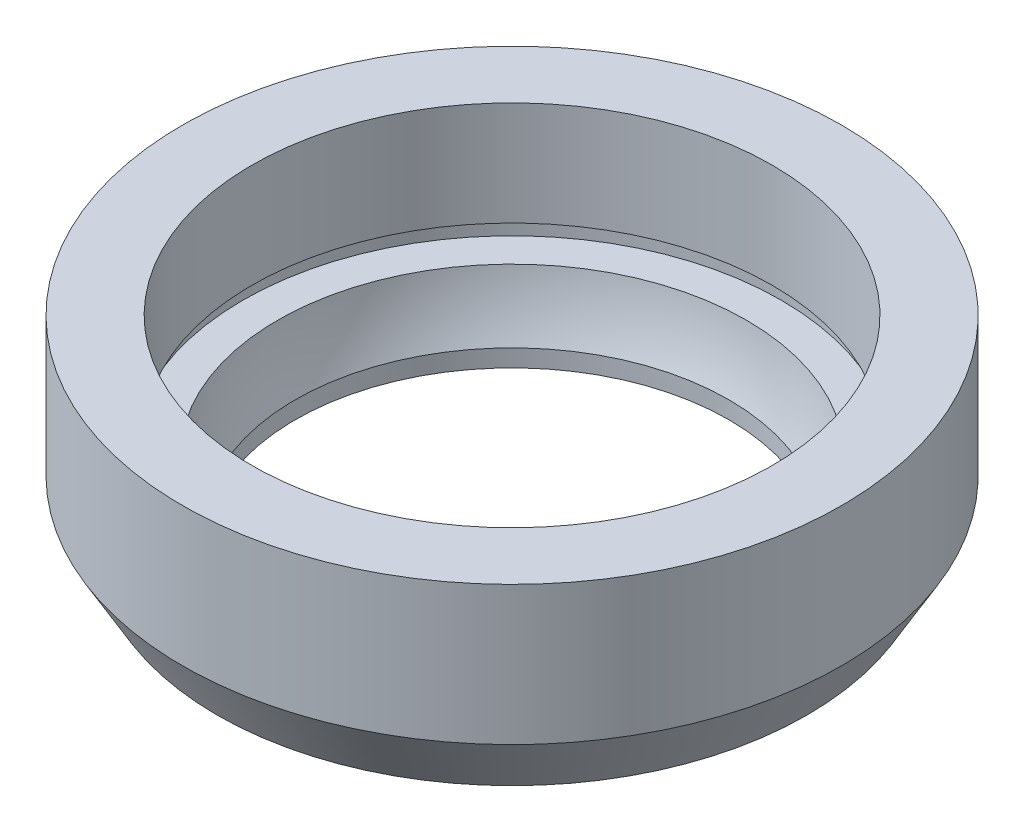
ISO-10303-21;
HEADER;
FILE_DESCRIPTION(('STEP AP214'),'2;1');
FILE_NAME('part.step','',(''),(''),'','','');
FILE_SCHEMA(('AUTOMOTIVE_DESIGN { 1 0 10303 214 1 1 1 1 }'));
ENDSEC;
DATA;
#1=APPLICATION_CONTEXT('core data for automotive mechanical design processes');
#2=APPLICATION_PROTOCOL_DEFINITION('international standard','automotive_design',2000,#1);
#3=PRODUCT_CONTEXT('',#1,'mechanical');
#4=PRODUCT('Part','Part','',(#3));
#5=PRODUCT_RELATED_PRODUCT_CATEGORY('part','',(#4));
#6=PRODUCT_DEFINITION_FORMATION('','',#4);
#7=PRODUCT_DEFINITION_CONTEXT('part definition',#1,'design');
#8=PRODUCT_DEFINITION('design','',#6,#7);
#9=PRODUCT_DEFINITION_SHAPE('','',#8);
#10=(LENGTH_UNIT() NAMED_UNIT(*) SI_UNIT(.MILLI.,.METRE.));
#11=(NAMED_UNIT(*) PLANE_ANGLE_UNIT() SI_UNIT($,.RADIAN.));
#12=(NAMED_UNIT(*) SI_UNIT($,.STERADIAN.) SOLID_ANGLE_UNIT());
#13=UNCERTAINTY_MEASURE_WITH_UNIT(LENGTH_MEASURE(1.E-05),#10,'distance_accuracy_value','');
#14=(GEOMETRIC_REPRESENTATION_CONTEXT(3) GLOBAL_UNCERTAINTY_ASSIGNED_CONTEXT((#13)) GLOBAL_UNIT_ASSIGNED_CONTEXT((#10,
#11,#12)) REPRESENTATION_CONTEXT('',''));
#15=CARTESIAN_POINT('',(0.,0.,0.));
#16=DIRECTION('',(0.,0.,1.));
#17=DIRECTION('',(1.,0.,0.));
#18=AXIS2_PLACEMENT_3D('',#15,#16,#17);
#19=CARTESIAN_POINT('',(0.,-120.969555658552,0.));
#20=DIRECTION('',(0.,-1.,0.));
#21=DIRECTION('',(0.,0.,-1.));
#22=AXIS2_PLACEMENT_3D('',#19,#20,#21);
#23=DEGENERATE_TOROIDAL_SURFACE('',#22,0.852252677091742,135.859768313158,.T.);
#24=CARTESIAN_POINT('',(0.,-141.511992468657,0.));
#25=DIRECTION('',(0.,-1.,0.));
#26=DIRECTION('',(0.,0.,-1.));
#27=AXIS2_PLACEMENT_3D('',#24,#25,#26);
#28=CIRCLE('',#27,135.15);
#29=CARTESIAN_POINT('',(0.,-141.511992468657,-135.15));
#30=VERTEX_POINT('',#29);
#31=EDGE_CURVE('E82',#30,#30,#28,.T.);
#32=ORIENTED_EDGE('',*,*,#31,.F.);
#33=EDGE_LOOP('',(#32));
#34=FACE_BOUND('',#33,.T.);
#35=CARTESIAN_POINT('',(0.,-176.153008620035,0.));
#36=DIRECTION('',(0.,-1.,0.));
#37=DIRECTION('',(0.,0.,-1.));
#38=AXIS2_PLACEMENT_3D('',#35,#36,#37);
#39=CIRCLE('',#38,125.);
#40=CARTESIAN_POINT('',(0.,-176.153008620035,-125.));
#41=VERTEX_POINT('',#40);
#42=EDGE_CURVE('E10',#41,#41,#39,.T.);
#43=ORIENTED_EDGE('',*,*,#42,.T.);
#44=EDGE_LOOP('',(#43));
#45=FACE_BOUND('',#44,.T.);
#46=ADVANCED_FACE('F39',(#34,#45),#23,.F.);
#47=CARTESIAN_POINT('',(0.,-202.934552656107,0.));
#48=DIRECTION('',(0.,-1.,0.));
#49=DIRECTION('',(0.,0.,-1.));
#50=AXIS2_PLACEMENT_3D('',#47,#48,#49);
#51=CYLINDRICAL_SURFACE('',#50,125.);
#52=ORIENTED_EDGE('',*,*,#42,.F.);
#53=EDGE_LOOP('',(#52));
#54=FACE_BOUND('',#53,.T.);
#55=CARTESIAN_POINT('',(0.,-186.153008620035,0.));
#56=DIRECTION('',(0.,-1.,0.));
#57=DIRECTION('',(0.,0.,-1.));
#58=AXIS2_PLACEMENT_3D('',#55,#56,#57);
#59=CIRCLE('',#58,125.);
#60=CARTESIAN_POINT('',(0.,-186.153008620035,-125.));
#61=VERTEX_POINT('',#60);
#62=EDGE_CURVE('E46',#61,#61,#59,.T.);
#63=ORIENTED_EDGE('',*,*,#62,.T.);
#64=EDGE_LOOP('',(#63));
#65=FACE_BOUND('',#64,.T.);
#66=ADVANCED_FACE('F90',(#54,#65),#51,.F.);
#67=CARTESIAN_POINT('',(0.,-186.153008620035,0.));
#68=DIRECTION('',(0.,-1.,0.));
#69=DIRECTION('',(0.,0.,-1.));
#70=AXIS2_PLACEMENT_3D('',#67,#68,#69);
#71=PLANE('',#70);
#72=CARTESIAN_POINT('',(0.,-186.153008620035,0.));
#73=DIRECTION('',(0.,-1.,0.));
#74=DIRECTION('',(0.,0.,-1.));
#75=AXIS2_PLACEMENT_3D('',#72,#73,#74);
#76=CIRCLE('',#75,170.);
#77=CARTESIAN_POINT('',(0.,-186.153008620035,-170.));
#78=VERTEX_POINT('',#77);
#79=EDGE_CURVE('E51',#78,#78,#76,.T.);
#80=ORIENTED_EDGE('',*,*,#79,.T.);
#81=EDGE_LOOP('',(#80));
#82=FACE_BOUND('',#81,.T.);
#83=ORIENTED_EDGE('',*,*,#62,.F.);
#84=EDGE_LOOP('',(#83));
#85=FACE_BOUND('',#84,.T.);
#86=ADVANCED_FACE('F94',(#82,#85),#71,.T.);
#87=CARTESIAN_POINT('',(0.,-186.153008620035,0.));
#88=DIRECTION('',(0.,1.,0.));
#89=DIRECTION('',(0.,0.,1.));
#90=AXIS2_PLACEMENT_3D('',#87,#88,#89);
#91=CONICAL_SURFACE('',#90,170.,0.523598775598296);
#92=CARTESIAN_POINT('',(0.,-151.511992468657,0.));
#93=DIRECTION('',(0.,-1.,0.));
#94=DIRECTION('',(0.,0.,-1.));
#95=AXIS2_PLACEMENT_3D('',#92,#93,#94);
#96=CIRCLE('',#95,190.);
#97=CARTESIAN_POINT('',(0.,-151.511992468657,-190.));
#98=VERTEX_POINT('',#97);
#99=EDGE_CURVE('E56',#98,#98,#96,.T.);
#100=ORIENTED_EDGE('',*,*,#99,.T.);
#101=EDGE_LOOP('',(#100));
#102=FACE_BOUND('',#101,.T.);
#103=ORIENTED_EDGE('',*,*,#79,.F.);
#104=EDGE_LOOP('',(#103));
#105=FACE_BOUND('',#104,.T.);
#106=ADVANCED_FACE('F99',(#102,#105),#91,.T.);
#107=CARTESIAN_POINT('',(0.,-202.934552656107,0.));
#108=DIRECTION('',(0.,-1.,0.));
#109=DIRECTION('',(0.,0.,-1.));
#110=AXIS2_PLACEMENT_3D('',#107,#108,#109);
#111=CYLINDRICAL_SURFACE('',#110,190.);
#112=CARTESIAN_POINT('',(0.,-71.5119924686572,0.));
#113=DIRECTION('',(0.,-1.,0.));
#114=DIRECTION('',(0.,0.,-1.));
#115=AXIS2_PLACEMENT_3D('',#112,#113,#114);
#116=CIRCLE('',#115,190.);
#117=CARTESIAN_POINT('',(0.,-71.5119924686572,-190.));
#118=VERTEX_POINT('',#117);
#119=EDGE_CURVE('E62',#118,#118,#116,.T.);
#120=ORIENTED_EDGE('',*,*,#119,.T.);
#121=EDGE_LOOP('',(#120));
#122=FACE_BOUND('',#121,.T.);
#123=ORIENTED_EDGE('',*,*,#99,.F.);
#124=EDGE_LOOP('',(#123));
#125=FACE_BOUND('',#124,.T.);
#126=ADVANCED_FACE('F105',(#122,#125),#111,.T.);
#127=CARTESIAN_POINT('',(0.,-71.5119924686572,0.));
#128=DIRECTION('',(0.,1.,0.));
#129=DIRECTION('',(0.,0.,1.));
#130=AXIS2_PLACEMENT_3D('',#127,#128,#129);
#131=PLANE('',#130);
#132=CARTESIAN_POINT('',(0.,-71.5119924686572,0.));
#133=DIRECTION('',(0.,-1.,0.));
#134=DIRECTION('',(0.,0.,-1.));
#135=AXIS2_PLACEMENT_3D('',#132,#133,#134);
#136=CIRCLE('',#135,150.);
#137=CARTESIAN_POINT('',(0.,-71.5119924686572,-150.));
#138=VERTEX_POINT('',#137);
#139=EDGE_CURVE('E66',#138,#138,#136,.T.);
#140=ORIENTED_EDGE('',*,*,#139,.T.);
#141=EDGE_LOOP('',(#140));
#142=FACE_BOUND('',#141,.T.);
#143=ORIENTED_EDGE('',*,*,#119,.F.);
#144=EDGE_LOOP('',(#143));
#145=FACE_BOUND('',#144,.T.);
#146=ADVANCED_FACE('F109',(#142,#145),#131,.T.);
#147=CARTESIAN_POINT('',(0.,-202.934552656107,0.));
#148=DIRECTION('',(0.,-1.,0.));
#149=DIRECTION('',(0.,0.,-1.));
#150=AXIS2_PLACEMENT_3D('',#147,#148,#149);
#151=CYLINDRICAL_SURFACE('',#150,150.);
#152=ORIENTED_EDGE('',*,*,#139,.F.);
#153=EDGE_LOOP('',(#152));
#154=FACE_BOUND('',#153,.T.);
#155=CARTESIAN_POINT('',(0.,-131.511992468657,0.));
#156=DIRECTION('',(0.,-1.,0.));
#157=DIRECTION('',(0.,0.,-1.));
#158=AXIS2_PLACEMENT_3D('',#155,#156,#157);
#159=CIRCLE('',#158,150.);
#160=CARTESIAN_POINT('',(0.,-131.511992468657,-150.));
#161=VERTEX_POINT('',#160);
#162=EDGE_CURVE('E70',#161,#161,#159,.T.);
#163=ORIENTED_EDGE('',*,*,#162,.T.);
#164=EDGE_LOOP('',(#163));
#165=FACE_BOUND('',#164,.T.);
#166=ADVANCED_FACE('F113',(#154,#165),#151,.F.);
#167=CARTESIAN_POINT('',(0.,-131.511992468657,0.));
#168=DIRECTION('',(0.,1.,0.));
#169=DIRECTION('',(0.,0.,1.));
#170=AXIS2_PLACEMENT_3D('',#167,#168,#169);
#171=PLANE('',#170);
#172=ORIENTED_EDGE('',*,*,#162,.F.);
#173=EDGE_LOOP('',(#172));
#174=FACE_BOUND('',#173,.T.);
#175=CARTESIAN_POINT('',(0.,-131.511992468657,0.));
#176=DIRECTION('',(0.,-1.,0.));
#177=DIRECTION('',(0.,0.,-1.));
#178=AXIS2_PLACEMENT_3D('',#175,#176,#177);
#179=CIRCLE('',#178,155.15);
#180=CARTESIAN_POINT('',(0.,-131.511992468657,-155.15));
#181=VERTEX_POINT('',#180);
#182=EDGE_CURVE('E74',#181,#181,#179,.T.);
#183=ORIENTED_EDGE('',*,*,#182,.T.);
#184=EDGE_LOOP('',(#183));
#185=FACE_BOUND('',#184,.T.);
#186=ADVANCED_FACE('F117',(#174,#185),#171,.F.);
#187=CARTESIAN_POINT('',(0.,-202.934552656107,0.));
#188=DIRECTION('',(0.,-1.,0.));
#189=DIRECTION('',(0.,0.,-1.));
#190=AXIS2_PLACEMENT_3D('',#187,#188,#189);
#191=CYLINDRICAL_SURFACE('',#190,155.15);
#192=ORIENTED_EDGE('',*,*,#182,.F.);
#193=EDGE_LOOP('',(#192));
#194=FACE_BOUND('',#193,.T.);
#195=CARTESIAN_POINT('',(0.,-141.511992468657,0.));
#196=DIRECTION('',(0.,-1.,0.));
#197=DIRECTION('',(0.,0.,-1.));
#198=AXIS2_PLACEMENT_3D('',#195,#196,#197);
#199=CIRCLE('',#198,155.15);
#200=CARTESIAN_POINT('',(0.,-141.511992468657,-155.15));
#201=VERTEX_POINT('',#200);
#202=EDGE_CURVE('E78',#201,#201,#199,.T.);
#203=ORIENTED_EDGE('',*,*,#202,.T.);
#204=EDGE_LOOP('',(#203));
#205=FACE_BOUND('',#204,.T.);
#206=ADVANCED_FACE('F121',(#194,#205),#191,.F.);
#207=CARTESIAN_POINT('',(0.,-141.511992468657,0.));
#208=DIRECTION('',(0.,-1.,0.));
#209=DIRECTION('',(0.,0.,-1.));
#210=AXIS2_PLACEMENT_3D('',#207,#208,#209);
#211=PLANE('',#210);
#212=ORIENTED_EDGE('',*,*,#202,.F.);
#213=EDGE_LOOP('',(#212));
#214=FACE_BOUND('',#213,.T.);
#215=ORIENTED_EDGE('',*,*,#31,.T.);
#216=EDGE_LOOP('',(#215));
#217=FACE_BOUND('',#216,.T.);
#218=ADVANCED_FACE('F87',(#214,#217),#211,.F.);
#219=CLOSED_SHELL('',(#46,#66,#86,#106,#126,#146,#166,#186,#206,#218));
#220=MANIFOLD_SOLID_BREP('B2',#219);
#221=ADVANCED_BREP_SHAPE_REPRESENTATION('',(#18,#220),#14);
#222=SHAPE_DEFINITION_REPRESENTATION(#9,#221);
ENDSEC;
END-ISO-10303-21;
